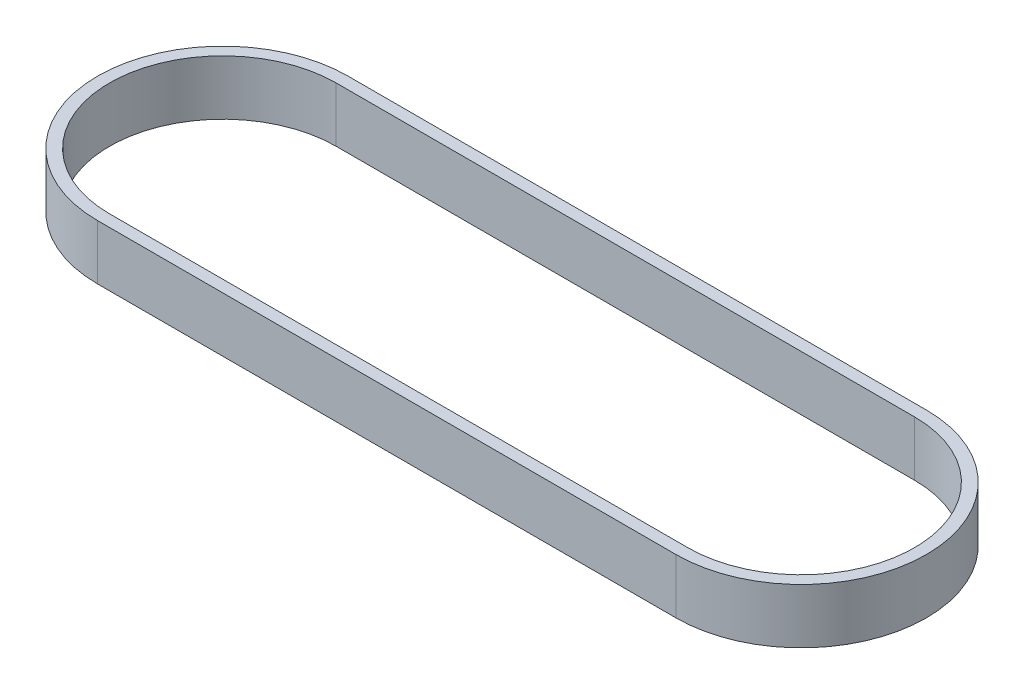
ISO-10303-21;
HEADER;
FILE_DESCRIPTION(('STEP AP214'),'2;1');
FILE_NAME('part.step','',(''),(''),'','','');
FILE_SCHEMA(('AUTOMOTIVE_DESIGN { 1 0 10303 214 1 1 1 1 }'));
ENDSEC;
DATA;
#1=APPLICATION_CONTEXT('core data for automotive mechanical design processes');
#2=APPLICATION_PROTOCOL_DEFINITION('international standard','automotive_design',2000,#1);
#3=PRODUCT_CONTEXT('',#1,'mechanical');
#4=PRODUCT('Part','Part','',(#3));
#5=PRODUCT_RELATED_PRODUCT_CATEGORY('part','',(#4));
#6=PRODUCT_DEFINITION_FORMATION('','',#4);
#7=PRODUCT_DEFINITION_CONTEXT('part definition',#1,'design');
#8=PRODUCT_DEFINITION('design','',#6,#7);
#9=PRODUCT_DEFINITION_SHAPE('','',#8);
#10=(LENGTH_UNIT() NAMED_UNIT(*) SI_UNIT(.MILLI.,.METRE.));
#11=(NAMED_UNIT(*) PLANE_ANGLE_UNIT() SI_UNIT($,.RADIAN.));
#12=(NAMED_UNIT(*) SI_UNIT($,.STERADIAN.) SOLID_ANGLE_UNIT());
#13=UNCERTAINTY_MEASURE_WITH_UNIT(LENGTH_MEASURE(1.E-05),#10,'distance_accuracy_value','');
#14=(GEOMETRIC_REPRESENTATION_CONTEXT(3) GLOBAL_UNCERTAINTY_ASSIGNED_CONTEXT((#13)) GLOBAL_UNIT_ASSIGNED_CONTEXT((#10,
#11,#12)) REPRESENTATION_CONTEXT('',''));
#15=CARTESIAN_POINT('',(0.,0.,0.));
#16=DIRECTION('',(0.,0.,1.));
#17=DIRECTION('',(1.,0.,0.));
#18=AXIS2_PLACEMENT_3D('',#15,#16,#17);
#19=CARTESIAN_POINT('',(48.745,9.25,0.));
#20=DIRECTION('',(0.,-1.,0.));
#21=DIRECTION('',(0.,0.,-1.));
#22=AXIS2_PLACEMENT_3D('',#19,#20,#21);
#23=PLANE('',#22);
#24=CARTESIAN_POINT('',(48.745,9.25,0.));
#25=DIRECTION('',(0.,1.,0.));
#26=DIRECTION('',(0.,0.,-1.));
#27=AXIS2_PLACEMENT_3D('',#24,#25,#26);
#28=CIRCLE('',#27,21.1);
#29=CARTESIAN_POINT('',(48.745,9.25,21.1));
#30=VERTEX_POINT('',#29);
#31=CARTESIAN_POINT('',(48.745,9.25,-21.1));
#32=VERTEX_POINT('',#31);
#33=EDGE_CURVE('E155',#30,#32,#28,.T.);
#34=ORIENTED_EDGE('',*,*,#33,.T.);
#35=DIRECTION('',(-1.,0.,0.));
#36=VECTOR('',#35,1.);
#37=CARTESIAN_POINT('',(-48.745,9.25,-21.1));
#38=LINE('',#37,#36);
#39=CARTESIAN_POINT('',(-48.745,9.25,-21.1));
#40=VERTEX_POINT('',#39);
#41=EDGE_CURVE('E159',#32,#40,#38,.T.);
#42=ORIENTED_EDGE('',*,*,#41,.T.);
#43=CARTESIAN_POINT('',(-48.745,9.25,0.));
#44=DIRECTION('',(0.,1.,0.));
#45=DIRECTION('',(0.,0.,1.));
#46=AXIS2_PLACEMENT_3D('',#43,#44,#45);
#47=CIRCLE('',#46,21.1);
#48=CARTESIAN_POINT('',(-48.745,9.25,21.1));
#49=VERTEX_POINT('',#48);
#50=EDGE_CURVE('E163',#40,#49,#47,.T.);
#51=ORIENTED_EDGE('',*,*,#50,.T.);
#52=DIRECTION('',(1.,0.,0.));
#53=VECTOR('',#52,1.);
#54=CARTESIAN_POINT('',(-48.745,9.25,21.1));
#55=LINE('',#54,#53);
#56=EDGE_CURVE('E166',#49,#30,#55,.T.);
#57=ORIENTED_EDGE('',*,*,#56,.T.);
#58=EDGE_LOOP('',(#34,#42,#51,#57));
#59=FACE_BOUND('',#58,.T.);
#60=CARTESIAN_POINT('',(-48.745,9.25,0.));
#61=DIRECTION('',(0.,1.,0.));
#62=DIRECTION('',(0.,0.,1.));
#63=AXIS2_PLACEMENT_3D('',#60,#61,#62);
#64=CIRCLE('',#63,19.1);
#65=CARTESIAN_POINT('',(-48.745,9.25,-19.1));
#66=VERTEX_POINT('',#65);
#67=CARTESIAN_POINT('',(-48.745,9.25,19.1));
#68=VERTEX_POINT('',#67);
#69=EDGE_CURVE('E107',#66,#68,#64,.T.);
#70=ORIENTED_EDGE('',*,*,#69,.F.);
#71=DIRECTION('',(-1.,0.,0.));
#72=VECTOR('',#71,1.);
#73=CARTESIAN_POINT('',(-48.745,9.25,-19.1));
#74=LINE('',#73,#72);
#75=CARTESIAN_POINT('',(48.745,9.25,-19.1));
#76=VERTEX_POINT('',#75);
#77=EDGE_CURVE('E133',#76,#66,#74,.T.);
#78=ORIENTED_EDGE('',*,*,#77,.F.);
#79=CARTESIAN_POINT('',(48.745,9.25,0.));
#80=DIRECTION('',(0.,1.,0.));
#81=DIRECTION('',(0.,0.,-1.));
#82=AXIS2_PLACEMENT_3D('',#79,#80,#81);
#83=CIRCLE('',#82,19.1);
#84=CARTESIAN_POINT('',(48.745,9.25,19.1));
#85=VERTEX_POINT('',#84);
#86=EDGE_CURVE('E129',#85,#76,#83,.T.);
#87=ORIENTED_EDGE('',*,*,#86,.F.);
#88=DIRECTION('',(1.,0.,0.));
#89=VECTOR('',#88,1.);
#90=CARTESIAN_POINT('',(-48.745,9.25,19.1));
#91=LINE('',#90,#89);
#92=EDGE_CURVE('E116',#68,#85,#91,.T.);
#93=ORIENTED_EDGE('',*,*,#92,.F.);
#94=EDGE_LOOP('',(#70,#78,#87,#93));
#95=FACE_BOUND('',#94,.T.);
#96=ADVANCED_FACE('F41',(#59,#95),#23,.F.);
#97=CARTESIAN_POINT('',(48.745,0.,0.));
#98=DIRECTION('',(0.,-1.,0.));
#99=DIRECTION('',(0.,0.,-1.));
#100=AXIS2_PLACEMENT_3D('',#97,#98,#99);
#101=PLANE('',#100);
#102=CARTESIAN_POINT('',(48.745,0.,0.));
#103=DIRECTION('',(0.,1.,0.));
#104=DIRECTION('',(0.,0.,-1.));
#105=AXIS2_PLACEMENT_3D('',#102,#103,#104);
#106=CIRCLE('',#105,21.1);
#107=CARTESIAN_POINT('',(48.745,0.,21.1));
#108=VERTEX_POINT('',#107);
#109=CARTESIAN_POINT('',(48.745,0.,-21.1));
#110=VERTEX_POINT('',#109);
#111=EDGE_CURVE('E125',#108,#110,#106,.T.);
#112=ORIENTED_EDGE('',*,*,#111,.F.);
#113=DIRECTION('',(1.,0.,0.));
#114=VECTOR('',#113,1.);
#115=CARTESIAN_POINT('',(-48.745,0.,21.1));
#116=LINE('',#115,#114);
#117=CARTESIAN_POINT('',(-48.745,0.,21.1));
#118=VERTEX_POINT('',#117);
#119=EDGE_CURVE('E160',#118,#108,#116,.T.);
#120=ORIENTED_EDGE('',*,*,#119,.F.);
#121=CARTESIAN_POINT('',(-48.745,0.,0.));
#122=DIRECTION('',(0.,1.,0.));
#123=DIRECTION('',(0.,0.,1.));
#124=AXIS2_PLACEMENT_3D('',#121,#122,#123);
#125=CIRCLE('',#124,21.1);
#126=CARTESIAN_POINT('',(-48.745,0.,-21.1));
#127=VERTEX_POINT('',#126);
#128=EDGE_CURVE('E176',#127,#118,#125,.T.);
#129=ORIENTED_EDGE('',*,*,#128,.F.);
#130=DIRECTION('',(-1.,0.,0.));
#131=VECTOR('',#130,1.);
#132=CARTESIAN_POINT('',(-48.745,0.,-21.1));
#133=LINE('',#132,#131);
#134=EDGE_CURVE('E173',#110,#127,#133,.T.);
#135=ORIENTED_EDGE('',*,*,#134,.F.);
#136=EDGE_LOOP('',(#112,#120,#129,#135));
#137=FACE_BOUND('',#136,.T.);
#138=DIRECTION('',(-1.,0.,0.));
#139=VECTOR('',#138,1.);
#140=CARTESIAN_POINT('',(-48.745,0.,-19.1));
#141=LINE('',#140,#139);
#142=CARTESIAN_POINT('',(48.745,0.,-19.1));
#143=VERTEX_POINT('',#142);
#144=CARTESIAN_POINT('',(-48.745,0.,-19.1));
#145=VERTEX_POINT('',#144);
#146=EDGE_CURVE('E117',#143,#145,#141,.T.);
#147=ORIENTED_EDGE('',*,*,#146,.T.);
#148=CARTESIAN_POINT('',(-48.745,0.,0.));
#149=DIRECTION('',(0.,1.,0.));
#150=DIRECTION('',(0.,0.,1.));
#151=AXIS2_PLACEMENT_3D('',#148,#149,#150);
#152=CIRCLE('',#151,19.1);
#153=CARTESIAN_POINT('',(-48.745,0.,19.1));
#154=VERTEX_POINT('',#153);
#155=EDGE_CURVE('E65',#145,#154,#152,.T.);
#156=ORIENTED_EDGE('',*,*,#155,.T.);
#157=DIRECTION('',(1.,0.,0.));
#158=VECTOR('',#157,1.);
#159=CARTESIAN_POINT('',(-48.745,0.,19.1));
#160=LINE('',#159,#158);
#161=CARTESIAN_POINT('',(48.745,0.,19.1));
#162=VERTEX_POINT('',#161);
#163=EDGE_CURVE('E123',#154,#162,#160,.T.);
#164=ORIENTED_EDGE('',*,*,#163,.T.);
#165=CARTESIAN_POINT('',(48.745,0.,0.));
#166=DIRECTION('',(0.,1.,0.));
#167=DIRECTION('',(0.,0.,-1.));
#168=AXIS2_PLACEMENT_3D('',#165,#166,#167);
#169=CIRCLE('',#168,19.1);
#170=EDGE_CURVE('E142',#162,#143,#169,.T.);
#171=ORIENTED_EDGE('',*,*,#170,.T.);
#172=EDGE_LOOP('',(#147,#156,#164,#171));
#173=FACE_BOUND('',#172,.T.);
#174=ADVANCED_FACE('F199',(#137,#173),#101,.T.);
#175=CARTESIAN_POINT('',(48.745,9.25,0.));
#176=DIRECTION('',(0.,-1.,0.));
#177=DIRECTION('',(0.,0.,-1.));
#178=AXIS2_PLACEMENT_3D('',#175,#176,#177);
#179=CYLINDRICAL_SURFACE('',#178,21.1);
#180=ORIENTED_EDGE('',*,*,#111,.T.);
#181=DIRECTION('',(0.,-1.,0.));
#182=VECTOR('',#181,1.);
#183=CARTESIAN_POINT('',(48.745,9.25,-21.1));
#184=LINE('',#183,#182);
#185=EDGE_CURVE('E11',#32,#110,#184,.T.);
#186=ORIENTED_EDGE('',*,*,#185,.F.);
#187=ORIENTED_EDGE('',*,*,#33,.F.);
#188=DIRECTION('',(0.,-1.,0.));
#189=VECTOR('',#188,1.);
#190=CARTESIAN_POINT('',(48.745,9.25,21.1));
#191=LINE('',#190,#189);
#192=EDGE_CURVE('E169',#30,#108,#191,.T.);
#193=ORIENTED_EDGE('',*,*,#192,.T.);
#194=EDGE_LOOP('',(#180,#186,#187,#193));
#195=FACE_BOUND('',#194,.T.);
#196=ADVANCED_FACE('F43',(#195),#179,.T.);
#197=CARTESIAN_POINT('',(-48.745,9.25,-21.1));
#198=DIRECTION('',(0.,0.,1.));
#199=DIRECTION('',(1.,0.,0.));
#200=AXIS2_PLACEMENT_3D('',#197,#198,#199);
#201=PLANE('',#200);
#202=ORIENTED_EDGE('',*,*,#134,.T.);
#203=DIRECTION('',(0.,-1.,0.));
#204=VECTOR('',#203,1.);
#205=CARTESIAN_POINT('',(-48.745,9.25,-21.1));
#206=LINE('',#205,#204);
#207=EDGE_CURVE('E50',#40,#127,#206,.T.);
#208=ORIENTED_EDGE('',*,*,#207,.F.);
#209=ORIENTED_EDGE('',*,*,#41,.F.);
#210=ORIENTED_EDGE('',*,*,#185,.T.);
#211=EDGE_LOOP('',(#202,#208,#209,#210));
#212=FACE_BOUND('',#211,.T.);
#213=ADVANCED_FACE('F209',(#212),#201,.F.);
#214=CARTESIAN_POINT('',(-48.745,9.25,0.));
#215=DIRECTION('',(0.,-1.,0.));
#216=DIRECTION('',(0.,0.,-1.));
#217=AXIS2_PLACEMENT_3D('',#214,#215,#216);
#218=CYLINDRICAL_SURFACE('',#217,21.1);
#219=ORIENTED_EDGE('',*,*,#128,.T.);
#220=DIRECTION('',(0.,-1.,0.));
#221=VECTOR('',#220,1.);
#222=CARTESIAN_POINT('',(-48.745,9.25,21.1));
#223=LINE('',#222,#221);
#224=EDGE_CURVE('E184',#49,#118,#223,.T.);
#225=ORIENTED_EDGE('',*,*,#224,.F.);
#226=ORIENTED_EDGE('',*,*,#50,.F.);
#227=ORIENTED_EDGE('',*,*,#207,.T.);
#228=EDGE_LOOP('',(#219,#225,#226,#227));
#229=FACE_BOUND('',#228,.T.);
#230=ADVANCED_FACE('F193',(#229),#218,.T.);
#231=CARTESIAN_POINT('',(-48.745,9.25,21.1));
#232=DIRECTION('',(0.,0.,-1.));
#233=DIRECTION('',(-1.,0.,0.));
#234=AXIS2_PLACEMENT_3D('',#231,#232,#233);
#235=PLANE('',#234);
#236=ORIENTED_EDGE('',*,*,#119,.T.);
#237=ORIENTED_EDGE('',*,*,#192,.F.);
#238=ORIENTED_EDGE('',*,*,#56,.F.);
#239=ORIENTED_EDGE('',*,*,#224,.T.);
#240=EDGE_LOOP('',(#236,#237,#238,#239));
#241=FACE_BOUND('',#240,.T.);
#242=ADVANCED_FACE('F203',(#241),#235,.F.);
#243=CARTESIAN_POINT('',(-48.745,9.25,0.));
#244=DIRECTION('',(0.,-1.,0.));
#245=DIRECTION('',(0.,0.,-1.));
#246=AXIS2_PLACEMENT_3D('',#243,#244,#245);
#247=CYLINDRICAL_SURFACE('',#246,19.1);
#248=ORIENTED_EDGE('',*,*,#155,.F.);
#249=DIRECTION('',(0.,-1.,0.));
#250=VECTOR('',#249,1.);
#251=CARTESIAN_POINT('',(-48.745,9.25,-19.1));
#252=LINE('',#251,#250);
#253=EDGE_CURVE('E111',#66,#145,#252,.T.);
#254=ORIENTED_EDGE('',*,*,#253,.F.);
#255=ORIENTED_EDGE('',*,*,#69,.T.);
#256=DIRECTION('',(0.,-1.,0.));
#257=VECTOR('',#256,1.);
#258=CARTESIAN_POINT('',(-48.745,9.25,19.1));
#259=LINE('',#258,#257);
#260=EDGE_CURVE('E110',#68,#154,#259,.T.);
#261=ORIENTED_EDGE('',*,*,#260,.T.);
#262=EDGE_LOOP('',(#248,#254,#255,#261));
#263=FACE_BOUND('',#262,.T.);
#264=ADVANCED_FACE('F109',(#263),#247,.F.);
#265=CARTESIAN_POINT('',(-48.745,9.25,19.1));
#266=DIRECTION('',(0.,0.,-1.));
#267=DIRECTION('',(-1.,0.,0.));
#268=AXIS2_PLACEMENT_3D('',#265,#266,#267);
#269=PLANE('',#268);
#270=ORIENTED_EDGE('',*,*,#163,.F.);
#271=ORIENTED_EDGE('',*,*,#260,.F.);
#272=ORIENTED_EDGE('',*,*,#92,.T.);
#273=DIRECTION('',(0.,-1.,0.));
#274=VECTOR('',#273,1.);
#275=CARTESIAN_POINT('',(48.745,9.25,19.1));
#276=LINE('',#275,#274);
#277=EDGE_CURVE('E126',#85,#162,#276,.T.);
#278=ORIENTED_EDGE('',*,*,#277,.T.);
#279=EDGE_LOOP('',(#270,#271,#272,#278));
#280=FACE_BOUND('',#279,.T.);
#281=ADVANCED_FACE('F120',(#280),#269,.T.);
#282=CARTESIAN_POINT('',(48.745,9.25,0.));
#283=DIRECTION('',(0.,-1.,0.));
#284=DIRECTION('',(0.,0.,-1.));
#285=AXIS2_PLACEMENT_3D('',#282,#283,#284);
#286=CYLINDRICAL_SURFACE('',#285,19.1);
#287=ORIENTED_EDGE('',*,*,#170,.F.);
#288=ORIENTED_EDGE('',*,*,#277,.F.);
#289=ORIENTED_EDGE('',*,*,#86,.T.);
#290=DIRECTION('',(0.,-1.,0.));
#291=VECTOR('',#290,1.);
#292=CARTESIAN_POINT('',(48.745,9.25,-19.1));
#293=LINE('',#292,#291);
#294=EDGE_CURVE('E57',#76,#143,#293,.T.);
#295=ORIENTED_EDGE('',*,*,#294,.T.);
#296=EDGE_LOOP('',(#287,#288,#289,#295));
#297=FACE_BOUND('',#296,.T.);
#298=ADVANCED_FACE('F232',(#297),#286,.F.);
#299=CARTESIAN_POINT('',(-48.745,9.25,-19.1));
#300=DIRECTION('',(0.,0.,1.));
#301=DIRECTION('',(1.,0.,0.));
#302=AXIS2_PLACEMENT_3D('',#299,#300,#301);
#303=PLANE('',#302);
#304=ORIENTED_EDGE('',*,*,#146,.F.);
#305=ORIENTED_EDGE('',*,*,#294,.F.);
#306=ORIENTED_EDGE('',*,*,#77,.T.);
#307=ORIENTED_EDGE('',*,*,#253,.T.);
#308=EDGE_LOOP('',(#304,#305,#306,#307));
#309=FACE_BOUND('',#308,.T.);
#310=ADVANCED_FACE('F236',(#309),#303,.T.);
#311=CLOSED_SHELL('',(#96,#174,#196,#213,#230,#242,#264,#281,#298,#310));
#312=MANIFOLD_SOLID_BREP('B2',#311);
#313=ADVANCED_BREP_SHAPE_REPRESENTATION('',(#18,#312),#14);
#314=SHAPE_DEFINITION_REPRESENTATION(#9,#313);
ENDSEC;
END-ISO-10303-21;
